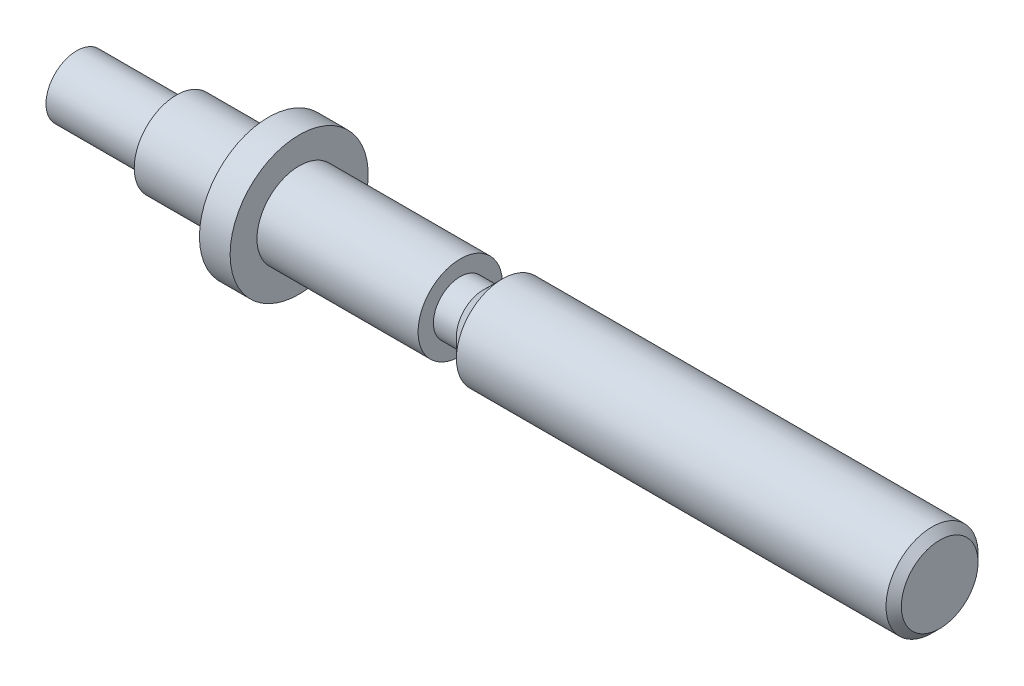
ISO-10303-21;
HEADER;
FILE_DESCRIPTION(('STEP AP214'),'2;1');
FILE_NAME('part.step','',(''),(''),'','','');
FILE_SCHEMA(('AUTOMOTIVE_DESIGN { 1 0 10303 214 1 1 1 1 }'));
ENDSEC;
DATA;
#1=APPLICATION_CONTEXT('core data for automotive mechanical design processes');
#2=APPLICATION_PROTOCOL_DEFINITION('international standard','automotive_design',2000,#1);
#3=PRODUCT_CONTEXT('',#1,'mechanical');
#4=PRODUCT('Part','Part','',(#3));
#5=PRODUCT_RELATED_PRODUCT_CATEGORY('part','',(#4));
#6=PRODUCT_DEFINITION_FORMATION('','',#4);
#7=PRODUCT_DEFINITION_CONTEXT('part definition',#1,'design');
#8=PRODUCT_DEFINITION('design','',#6,#7);
#9=PRODUCT_DEFINITION_SHAPE('','',#8);
#10=(LENGTH_UNIT() NAMED_UNIT(*) SI_UNIT(.MILLI.,.METRE.));
#11=(NAMED_UNIT(*) PLANE_ANGLE_UNIT() SI_UNIT($,.RADIAN.));
#12=(NAMED_UNIT(*) SI_UNIT($,.STERADIAN.) SOLID_ANGLE_UNIT());
#13=UNCERTAINTY_MEASURE_WITH_UNIT(LENGTH_MEASURE(1.E-05),#10,'distance_accuracy_value','');
#14=(GEOMETRIC_REPRESENTATION_CONTEXT(3) GLOBAL_UNCERTAINTY_ASSIGNED_CONTEXT((#13)) GLOBAL_UNIT_ASSIGNED_CONTEXT((#10,
#11,#12)) REPRESENTATION_CONTEXT('',''));
#15=CARTESIAN_POINT('',(0.,0.,0.));
#16=DIRECTION('',(0.,0.,1.));
#17=DIRECTION('',(1.,0.,0.));
#18=AXIS2_PLACEMENT_3D('',#15,#16,#17);
#19=CARTESIAN_POINT('',(0.,0.,0.));
#20=DIRECTION('',(1.,0.,0.));
#21=DIRECTION('',(0.,0.,-1.));
#22=AXIS2_PLACEMENT_3D('',#19,#20,#21);
#23=PLANE('',#22);
#24=CARTESIAN_POINT('',(0.,0.,0.));
#25=DIRECTION('',(-1.,0.,0.));
#26=DIRECTION('',(0.,0.,1.));
#27=AXIS2_PLACEMENT_3D('',#24,#25,#26);
#28=CIRCLE('',#27,1.64999999999999);
#29=CARTESIAN_POINT('',(0.,0.,1.64999999999999));
#30=VERTEX_POINT('',#29);
#31=EDGE_CURVE('E51',#30,#30,#28,.T.);
#32=ORIENTED_EDGE('',*,*,#31,.F.);
#33=EDGE_LOOP('',(#32));
#34=FACE_BOUND('',#33,.T.);
#35=CARTESIAN_POINT('',(0.,0.,0.));
#36=DIRECTION('',(-1.,0.,0.));
#37=DIRECTION('',(0.,0.,1.));
#38=AXIS2_PLACEMENT_3D('',#35,#36,#37);
#39=CIRCLE('',#38,4.);
#40=CARTESIAN_POINT('',(0.,0.,4.));
#41=VERTEX_POINT('',#40);
#42=EDGE_CURVE('E11',#41,#41,#39,.T.);
#43=ORIENTED_EDGE('',*,*,#42,.T.);
#44=EDGE_LOOP('',(#43));
#45=FACE_BOUND('',#44,.T.);
#46=ADVANCED_FACE('F33',(#34,#45),#23,.F.);
#47=CARTESIAN_POINT('',(-83.6942434210526,0.,0.));
#48=DIRECTION('',(-1.,0.,0.));
#49=DIRECTION('',(0.,0.,1.));
#50=AXIS2_PLACEMENT_3D('',#47,#48,#49);
#51=CYLINDRICAL_SURFACE('',#50,4.);
#52=ORIENTED_EDGE('',*,*,#42,.F.);
#53=EDGE_LOOP('',(#52));
#54=FACE_BOUND('',#53,.T.);
#55=CARTESIAN_POINT('',(13.,0.,0.));
#56=DIRECTION('',(-1.,0.,0.));
#57=DIRECTION('',(0.,0.,1.));
#58=AXIS2_PLACEMENT_3D('',#55,#56,#57);
#59=CIRCLE('',#58,4.);
#60=CARTESIAN_POINT('',(13.,0.,4.));
#61=VERTEX_POINT('',#60);
#62=EDGE_CURVE('E39',#61,#61,#59,.T.);
#63=ORIENTED_EDGE('',*,*,#62,.T.);
#64=EDGE_LOOP('',(#63));
#65=FACE_BOUND('',#64,.T.);
#66=ADVANCED_FACE('F91',(#54,#65),#51,.T.);
#67=CARTESIAN_POINT('',(13.,4.,0.));
#68=DIRECTION('',(1.,0.,0.));
#69=DIRECTION('',(0.,0.,-1.));
#70=AXIS2_PLACEMENT_3D('',#67,#68,#69);
#71=PLANE('',#70);
#72=ORIENTED_EDGE('',*,*,#62,.F.);
#73=EDGE_LOOP('',(#72));
#74=FACE_BOUND('',#73,.T.);
#75=CARTESIAN_POINT('',(13.,0.,0.));
#76=DIRECTION('',(-1.,0.,0.));
#77=DIRECTION('',(0.,0.,1.));
#78=AXIS2_PLACEMENT_3D('',#75,#76,#77);
#79=CIRCLE('',#78,5.5);
#80=CARTESIAN_POINT('',(13.,0.,5.5));
#81=VERTEX_POINT('',#80);
#82=EDGE_CURVE('E86',#81,#81,#79,.T.);
#83=ORIENTED_EDGE('',*,*,#82,.T.);
#84=EDGE_LOOP('',(#83));
#85=FACE_BOUND('',#84,.T.);
#86=ADVANCED_FACE('F93',(#74,#85),#71,.F.);
#87=CARTESIAN_POINT('',(-83.6942434210526,0.,0.));
#88=DIRECTION('',(-1.,0.,0.));
#89=DIRECTION('',(0.,0.,1.));
#90=AXIS2_PLACEMENT_3D('',#87,#88,#89);
#91=CYLINDRICAL_SURFACE('',#90,5.5);
#92=ORIENTED_EDGE('',*,*,#82,.F.);
#93=EDGE_LOOP('',(#92));
#94=FACE_BOUND('',#93,.T.);
#95=CARTESIAN_POINT('',(25.,0.,0.));
#96=DIRECTION('',(-1.,0.,0.));
#97=DIRECTION('',(0.,0.,1.));
#98=AXIS2_PLACEMENT_3D('',#95,#96,#97);
#99=CIRCLE('',#98,5.5);
#100=CARTESIAN_POINT('',(25.,0.,5.5));
#101=VERTEX_POINT('',#100);
#102=EDGE_CURVE('E83',#101,#101,#99,.T.);
#103=ORIENTED_EDGE('',*,*,#102,.T.);
#104=EDGE_LOOP('',(#103));
#105=FACE_BOUND('',#104,.T.);
#106=ADVANCED_FACE('F96',(#94,#105),#91,.T.);
#107=CARTESIAN_POINT('',(25.,5.50000000000001,0.));
#108=DIRECTION('',(1.,0.,0.));
#109=DIRECTION('',(0.,0.,-1.));
#110=AXIS2_PLACEMENT_3D('',#107,#108,#109);
#111=PLANE('',#110);
#112=ORIENTED_EDGE('',*,*,#102,.F.);
#113=EDGE_LOOP('',(#112));
#114=FACE_BOUND('',#113,.T.);
#115=CARTESIAN_POINT('',(25.,0.,0.));
#116=DIRECTION('',(-1.,0.,0.));
#117=DIRECTION('',(0.,0.,1.));
#118=AXIS2_PLACEMENT_3D('',#115,#116,#117);
#119=CIRCLE('',#118,8.99999999999999);
#120=CARTESIAN_POINT('',(25.,0.,8.99999999999999));
#121=VERTEX_POINT('',#120);
#122=EDGE_CURVE('E80',#121,#121,#119,.T.);
#123=ORIENTED_EDGE('',*,*,#122,.T.);
#124=EDGE_LOOP('',(#123));
#125=FACE_BOUND('',#124,.T.);
#126=ADVANCED_FACE('F102',(#114,#125),#111,.F.);
#127=CARTESIAN_POINT('',(-83.6942434210526,0.,0.));
#128=DIRECTION('',(-1.,0.,0.));
#129=DIRECTION('',(0.,0.,1.));
#130=AXIS2_PLACEMENT_3D('',#127,#128,#129);
#131=CYLINDRICAL_SURFACE('',#130,8.99999999999999);
#132=ORIENTED_EDGE('',*,*,#122,.F.);
#133=EDGE_LOOP('',(#132));
#134=FACE_BOUND('',#133,.T.);
#135=CARTESIAN_POINT('',(29.,0.,0.));
#136=DIRECTION('',(-1.,0.,0.));
#137=DIRECTION('',(0.,0.,1.));
#138=AXIS2_PLACEMENT_3D('',#135,#136,#137);
#139=CIRCLE('',#138,8.99999999999999);
#140=CARTESIAN_POINT('',(29.,0.,8.99999999999999));
#141=VERTEX_POINT('',#140);
#142=EDGE_CURVE('E77',#141,#141,#139,.T.);
#143=ORIENTED_EDGE('',*,*,#142,.T.);
#144=EDGE_LOOP('',(#143));
#145=FACE_BOUND('',#144,.T.);
#146=ADVANCED_FACE('F108',(#134,#145),#131,.T.);
#147=CARTESIAN_POINT('',(29.,8.99999999999998,0.));
#148=DIRECTION('',(-1.,0.,0.));
#149=DIRECTION('',(0.,0.,1.));
#150=AXIS2_PLACEMENT_3D('',#147,#148,#149);
#151=PLANE('',#150);
#152=ORIENTED_EDGE('',*,*,#142,.F.);
#153=EDGE_LOOP('',(#152));
#154=FACE_BOUND('',#153,.T.);
#155=CARTESIAN_POINT('',(29.,0.,0.));
#156=DIRECTION('',(-1.,0.,0.));
#157=DIRECTION('',(0.,0.,1.));
#158=AXIS2_PLACEMENT_3D('',#155,#156,#157);
#159=CIRCLE('',#158,5.49999999999999);
#160=CARTESIAN_POINT('',(29.,0.,5.49999999999999));
#161=VERTEX_POINT('',#160);
#162=EDGE_CURVE('E74',#161,#161,#159,.T.);
#163=ORIENTED_EDGE('',*,*,#162,.T.);
#164=EDGE_LOOP('',(#163));
#165=FACE_BOUND('',#164,.T.);
#166=ADVANCED_FACE('F114',(#154,#165),#151,.F.);
#167=CARTESIAN_POINT('',(-83.6942434210526,0.,0.));
#168=DIRECTION('',(-1.,0.,0.));
#169=DIRECTION('',(0.,0.,1.));
#170=AXIS2_PLACEMENT_3D('',#167,#168,#169);
#171=CYLINDRICAL_SURFACE('',#170,5.49999999999999);
#172=ORIENTED_EDGE('',*,*,#162,.F.);
#173=EDGE_LOOP('',(#172));
#174=FACE_BOUND('',#173,.T.);
#175=CARTESIAN_POINT('',(50.,0.,0.));
#176=DIRECTION('',(-1.,0.,0.));
#177=DIRECTION('',(0.,0.,1.));
#178=AXIS2_PLACEMENT_3D('',#175,#176,#177);
#179=CIRCLE('',#178,5.49999999999999);
#180=CARTESIAN_POINT('',(50.,0.,5.49999999999999));
#181=VERTEX_POINT('',#180);
#182=EDGE_CURVE('E71',#181,#181,#179,.T.);
#183=ORIENTED_EDGE('',*,*,#182,.T.);
#184=EDGE_LOOP('',(#183));
#185=FACE_BOUND('',#184,.T.);
#186=ADVANCED_FACE('F120',(#174,#185),#171,.T.);
#187=CARTESIAN_POINT('',(50.,5.49999999999999,0.));
#188=DIRECTION('',(-1.,0.,0.));
#189=DIRECTION('',(0.,0.,1.));
#190=AXIS2_PLACEMENT_3D('',#187,#188,#189);
#191=PLANE('',#190);
#192=ORIENTED_EDGE('',*,*,#182,.F.);
#193=EDGE_LOOP('',(#192));
#194=FACE_BOUND('',#193,.T.);
#195=CARTESIAN_POINT('',(50.,0.,0.));
#196=DIRECTION('',(-1.,0.,0.));
#197=DIRECTION('',(0.,0.,1.));
#198=AXIS2_PLACEMENT_3D('',#195,#196,#197);
#199=CIRCLE('',#198,3.49999999999999);
#200=CARTESIAN_POINT('',(50.,0.,3.49999999999999));
#201=VERTEX_POINT('',#200);
#202=EDGE_CURVE('E68',#201,#201,#199,.T.);
#203=ORIENTED_EDGE('',*,*,#202,.T.);
#204=EDGE_LOOP('',(#203));
#205=FACE_BOUND('',#204,.T.);
#206=ADVANCED_FACE('F126',(#194,#205),#191,.F.);
#207=CARTESIAN_POINT('',(-83.6942434210526,0.,0.));
#208=DIRECTION('',(-1.,0.,0.));
#209=DIRECTION('',(0.,0.,1.));
#210=AXIS2_PLACEMENT_3D('',#207,#208,#209);
#211=CYLINDRICAL_SURFACE('',#210,3.49999999999999);
#212=ORIENTED_EDGE('',*,*,#202,.F.);
#213=EDGE_LOOP('',(#212));
#214=FACE_BOUND('',#213,.T.);
#215=CARTESIAN_POINT('',(53.,0.,0.));
#216=DIRECTION('',(-1.,0.,0.));
#217=DIRECTION('',(0.,0.,1.));
#218=AXIS2_PLACEMENT_3D('',#215,#216,#217);
#219=CIRCLE('',#218,3.49999999999999);
#220=CARTESIAN_POINT('',(53.,0.,3.49999999999999));
#221=VERTEX_POINT('',#220);
#222=EDGE_CURVE('E65',#221,#221,#219,.T.);
#223=ORIENTED_EDGE('',*,*,#222,.T.);
#224=EDGE_LOOP('',(#223));
#225=FACE_BOUND('',#224,.T.);
#226=ADVANCED_FACE('F132',(#214,#225),#211,.T.);
#227=CARTESIAN_POINT('',(55.5,0.,0.));
#228=DIRECTION('',(1.,0.,0.));
#229=DIRECTION('',(0.,0.,-1.));
#230=AXIS2_PLACEMENT_3D('',#227,#228,#229);
#231=CONICAL_SURFACE('',#230,5.99999999999999,0.785398163397448);
#232=ORIENTED_EDGE('',*,*,#222,.F.);
#233=EDGE_LOOP('',(#232));
#234=FACE_BOUND('',#233,.T.);
#235=CARTESIAN_POINT('',(55.5,0.,0.));
#236=DIRECTION('',(-1.,0.,0.));
#237=DIRECTION('',(0.,0.,1.));
#238=AXIS2_PLACEMENT_3D('',#235,#236,#237);
#239=CIRCLE('',#238,5.99999999999999);
#240=CARTESIAN_POINT('',(55.5,0.,5.99999999999999));
#241=VERTEX_POINT('',#240);
#242=EDGE_CURVE('E62',#241,#241,#239,.T.);
#243=ORIENTED_EDGE('',*,*,#242,.T.);
#244=EDGE_LOOP('',(#243));
#245=FACE_BOUND('',#244,.T.);
#246=ADVANCED_FACE('F138',(#234,#245),#231,.T.);
#247=CARTESIAN_POINT('',(-83.6942434210526,0.,0.));
#248=DIRECTION('',(-1.,0.,0.));
#249=DIRECTION('',(0.,0.,1.));
#250=AXIS2_PLACEMENT_3D('',#247,#248,#249);
#251=CYLINDRICAL_SURFACE('',#250,5.99999999999999);
#252=ORIENTED_EDGE('',*,*,#242,.F.);
#253=EDGE_LOOP('',(#252));
#254=FACE_BOUND('',#253,.T.);
#255=CARTESIAN_POINT('',(111.5,0.,0.));
#256=DIRECTION('',(-1.,0.,0.));
#257=DIRECTION('',(0.,0.,1.));
#258=AXIS2_PLACEMENT_3D('',#255,#256,#257);
#259=CIRCLE('',#258,5.99999999999999);
#260=CARTESIAN_POINT('',(111.5,0.,5.99999999999999));
#261=VERTEX_POINT('',#260);
#262=EDGE_CURVE('E59',#261,#261,#259,.T.);
#263=ORIENTED_EDGE('',*,*,#262,.T.);
#264=EDGE_LOOP('',(#263));
#265=FACE_BOUND('',#264,.T.);
#266=ADVANCED_FACE('F144',(#254,#265),#251,.T.);
#267=CARTESIAN_POINT('',(112.5,0.,0.));
#268=DIRECTION('',(-1.,0.,0.));
#269=DIRECTION('',(0.,0.,1.));
#270=AXIS2_PLACEMENT_3D('',#267,#268,#269);
#271=CONICAL_SURFACE('',#270,5.,0.785398163397443);
#272=ORIENTED_EDGE('',*,*,#262,.F.);
#273=EDGE_LOOP('',(#272));
#274=FACE_BOUND('',#273,.T.);
#275=CARTESIAN_POINT('',(112.5,0.,0.));
#276=DIRECTION('',(-1.,0.,0.));
#277=DIRECTION('',(0.,0.,1.));
#278=AXIS2_PLACEMENT_3D('',#275,#276,#277);
#279=CIRCLE('',#278,5.);
#280=CARTESIAN_POINT('',(112.5,0.,5.));
#281=VERTEX_POINT('',#280);
#282=EDGE_CURVE('E54',#281,#281,#279,.T.);
#283=ORIENTED_EDGE('',*,*,#282,.T.);
#284=EDGE_LOOP('',(#283));
#285=FACE_BOUND('',#284,.T.);
#286=ADVANCED_FACE('F150',(#274,#285),#271,.T.);
#287=CARTESIAN_POINT('',(112.5,5.,0.));
#288=DIRECTION('',(-1.,0.,0.));
#289=DIRECTION('',(0.,0.,1.));
#290=AXIS2_PLACEMENT_3D('',#287,#288,#289);
#291=PLANE('',#290);
#292=ORIENTED_EDGE('',*,*,#282,.F.);
#293=EDGE_LOOP('',(#292));
#294=FACE_BOUND('',#293,.T.);
#295=ADVANCED_FACE('F156',(#294),#291,.F.);
#296=CARTESIAN_POINT('',(0.,0.,0.));
#297=DIRECTION('',(-1.,0.,0.));
#298=DIRECTION('',(0.,0.,1.));
#299=AXIS2_PLACEMENT_3D('',#296,#297,#298);
#300=CYLINDRICAL_SURFACE('',#299,1.64999999999999);
#301=CARTESIAN_POINT('',(11.1,0.,0.));
#302=DIRECTION('',(-1.,0.,0.));
#303=DIRECTION('',(0.,0.,1.));
#304=AXIS2_PLACEMENT_3D('',#301,#302,#303);
#305=CIRCLE('',#304,1.65);
#306=CARTESIAN_POINT('',(11.1,0.,1.65));
#307=VERTEX_POINT('',#306);
#308=EDGE_CURVE('E49',#307,#307,#305,.T.);
#309=ORIENTED_EDGE('',*,*,#308,.F.);
#310=EDGE_LOOP('',(#309));
#311=FACE_BOUND('',#310,.T.);
#312=ORIENTED_EDGE('',*,*,#31,.T.);
#313=EDGE_LOOP('',(#312));
#314=FACE_BOUND('',#313,.T.);
#315=ADVANCED_FACE('F45',(#311,#314),#300,.F.);
#316=CARTESIAN_POINT('',(11.1,0.,0.));
#317=DIRECTION('',(-1.,0.,0.));
#318=DIRECTION('',(0.,0.,1.));
#319=AXIS2_PLACEMENT_3D('',#316,#317,#318);
#320=CONICAL_SURFACE('',#319,1.65,1.02974425867665);
#321=CARTESIAN_POINT('',(12.0914200213955,0.,0.));
#322=VERTEX_POINT('',#321);
#323=VERTEX_LOOP('',#322);
#324=FACE_BOUND('',#323,.T.);
#325=ORIENTED_EDGE('',*,*,#308,.T.);
#326=EDGE_LOOP('',(#325));
#327=FACE_BOUND('',#326,.T.);
#328=ADVANCED_FACE('F42',(#324,#327),#320,.F.);
#329=CLOSED_SHELL('',(#46,#66,#86,#106,#126,#146,#166,#186,#206,#226,#246,#266,#286,#295,#315,#328));
#330=MANIFOLD_SOLID_BREP('B2',#329);
#331=ADVANCED_BREP_SHAPE_REPRESENTATION('',(#18,#330),#14);
#332=SHAPE_DEFINITION_REPRESENTATION(#9,#331);
ENDSEC;
END-ISO-10303-21;
